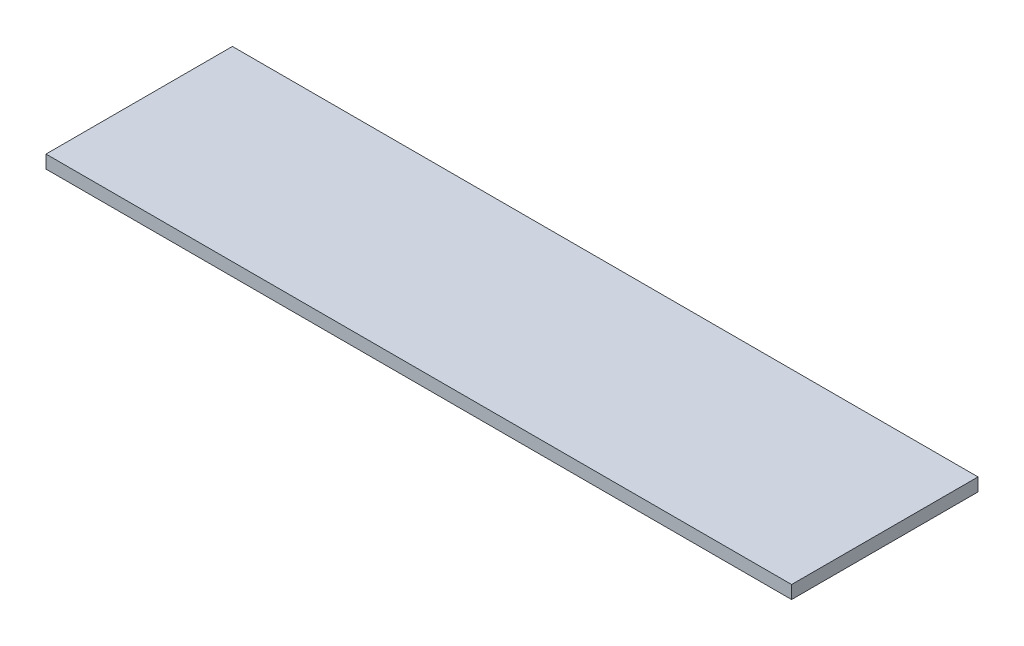
ISO-10303-21;
HEADER;
FILE_DESCRIPTION(('STEP AP214'),'2;1');
FILE_NAME('part.step','',(''),(''),'','','');
FILE_SCHEMA(('AUTOMOTIVE_DESIGN { 1 0 10303 214 1 1 1 1 }'));
ENDSEC;
DATA;
#1=APPLICATION_CONTEXT('core data for automotive mechanical design processes');
#2=APPLICATION_PROTOCOL_DEFINITION('international standard','automotive_design',2000,#1);
#3=PRODUCT_CONTEXT('',#1,'mechanical');
#4=PRODUCT('Part','Part','',(#3));
#5=PRODUCT_RELATED_PRODUCT_CATEGORY('part','',(#4));
#6=PRODUCT_DEFINITION_FORMATION('','',#4);
#7=PRODUCT_DEFINITION_CONTEXT('part definition',#1,'design');
#8=PRODUCT_DEFINITION('design','',#6,#7);
#9=PRODUCT_DEFINITION_SHAPE('','',#8);
#10=(LENGTH_UNIT() NAMED_UNIT(*) SI_UNIT(.MILLI.,.METRE.));
#11=(NAMED_UNIT(*) PLANE_ANGLE_UNIT() SI_UNIT($,.RADIAN.));
#12=(NAMED_UNIT(*) SI_UNIT($,.STERADIAN.) SOLID_ANGLE_UNIT());
#13=UNCERTAINTY_MEASURE_WITH_UNIT(LENGTH_MEASURE(1.E-05),#10,'distance_accuracy_value','');
#14=(GEOMETRIC_REPRESENTATION_CONTEXT(3) GLOBAL_UNCERTAINTY_ASSIGNED_CONTEXT((#13)) GLOBAL_UNIT_ASSIGNED_CONTEXT((#10,
#11,#12)) REPRESENTATION_CONTEXT('',''));
#15=CARTESIAN_POINT('',(0.,0.,0.));
#16=DIRECTION('',(0.,0.,1.));
#17=DIRECTION('',(1.,0.,0.));
#18=AXIS2_PLACEMENT_3D('',#15,#16,#17);
#19=CARTESIAN_POINT('',(20.,0.7,5.));
#20=DIRECTION('',(-1.,0.,0.));
#21=DIRECTION('',(0.,0.,1.));
#22=AXIS2_PLACEMENT_3D('',#19,#20,#21);
#23=PLANE('',#22);
#24=DIRECTION('',(0.,0.,-1.));
#25=VECTOR('',#24,1.);
#26=CARTESIAN_POINT('',(20.,0.,5.));
#27=LINE('',#26,#25);
#28=CARTESIAN_POINT('',(20.,0.,5.));
#29=VERTEX_POINT('',#28);
#30=CARTESIAN_POINT('',(20.,0.,-5.));
#31=VERTEX_POINT('',#30);
#32=EDGE_CURVE('E96',#29,#31,#27,.T.);
#33=ORIENTED_EDGE('',*,*,#32,.T.);
#34=DIRECTION('',(0.,-1.,0.));
#35=VECTOR('',#34,1.);
#36=CARTESIAN_POINT('',(20.,0.7,-5.));
#37=LINE('',#36,#35);
#38=CARTESIAN_POINT('',(20.,0.7,-5.));
#39=VERTEX_POINT('',#38);
#40=EDGE_CURVE('E11',#39,#31,#37,.T.);
#41=ORIENTED_EDGE('',*,*,#40,.F.);
#42=DIRECTION('',(0.,0.,-1.));
#43=VECTOR('',#42,1.);
#44=CARTESIAN_POINT('',(20.,0.7,5.));
#45=LINE('',#44,#43);
#46=CARTESIAN_POINT('',(20.,0.7,5.));
#47=VERTEX_POINT('',#46);
#48=EDGE_CURVE('E84',#47,#39,#45,.T.);
#49=ORIENTED_EDGE('',*,*,#48,.F.);
#50=DIRECTION('',(0.,-1.,0.));
#51=VECTOR('',#50,1.);
#52=CARTESIAN_POINT('',(20.,0.7,5.));
#53=LINE('',#52,#51);
#54=EDGE_CURVE('E92',#47,#29,#53,.T.);
#55=ORIENTED_EDGE('',*,*,#54,.T.);
#56=EDGE_LOOP('',(#33,#41,#49,#55));
#57=FACE_BOUND('',#56,.T.);
#58=ADVANCED_FACE('F33',(#57),#23,.F.);
#59=CARTESIAN_POINT('',(-20.,0.7,-5.));
#60=DIRECTION('',(0.,0.,1.));
#61=DIRECTION('',(1.,0.,0.));
#62=AXIS2_PLACEMENT_3D('',#59,#60,#61);
#63=PLANE('',#62);
#64=DIRECTION('',(-1.,0.,0.));
#65=VECTOR('',#64,1.);
#66=CARTESIAN_POINT('',(-20.,0.,-5.));
#67=LINE('',#66,#65);
#68=CARTESIAN_POINT('',(-20.,0.,-5.));
#69=VERTEX_POINT('',#68);
#70=EDGE_CURVE('E88',#31,#69,#67,.T.);
#71=ORIENTED_EDGE('',*,*,#70,.T.);
#72=DIRECTION('',(0.,-1.,0.));
#73=VECTOR('',#72,1.);
#74=CARTESIAN_POINT('',(-20.,0.7,-5.));
#75=LINE('',#74,#73);
#76=CARTESIAN_POINT('',(-20.,0.7,-5.));
#77=VERTEX_POINT('',#76);
#78=EDGE_CURVE('E41',#77,#69,#75,.T.);
#79=ORIENTED_EDGE('',*,*,#78,.F.);
#80=DIRECTION('',(-1.,0.,0.));
#81=VECTOR('',#80,1.);
#82=CARTESIAN_POINT('',(-20.,0.7,-5.));
#83=LINE('',#82,#81);
#84=EDGE_CURVE('E79',#39,#77,#83,.T.);
#85=ORIENTED_EDGE('',*,*,#84,.F.);
#86=ORIENTED_EDGE('',*,*,#40,.T.);
#87=EDGE_LOOP('',(#71,#79,#85,#86));
#88=FACE_BOUND('',#87,.T.);
#89=ADVANCED_FACE('F87',(#88),#63,.F.);
#90=CARTESIAN_POINT('',(-20.,0.7,5.));
#91=DIRECTION('',(1.,0.,0.));
#92=DIRECTION('',(0.,0.,-1.));
#93=AXIS2_PLACEMENT_3D('',#90,#91,#92);
#94=PLANE('',#93);
#95=DIRECTION('',(0.,0.,1.));
#96=VECTOR('',#95,1.);
#97=CARTESIAN_POINT('',(-20.,0.,5.));
#98=LINE('',#97,#96);
#99=CARTESIAN_POINT('',(-20.,0.,5.));
#100=VERTEX_POINT('',#99);
#101=EDGE_CURVE('E66',#69,#100,#98,.T.);
#102=ORIENTED_EDGE('',*,*,#101,.T.);
#103=DIRECTION('',(0.,-1.,0.));
#104=VECTOR('',#103,1.);
#105=CARTESIAN_POINT('',(-20.,0.7,5.));
#106=LINE('',#105,#104);
#107=CARTESIAN_POINT('',(-20.,0.7,5.));
#108=VERTEX_POINT('',#107);
#109=EDGE_CURVE('E89',#108,#100,#106,.T.);
#110=ORIENTED_EDGE('',*,*,#109,.F.);
#111=DIRECTION('',(0.,0.,1.));
#112=VECTOR('',#111,1.);
#113=CARTESIAN_POINT('',(-20.,0.7,5.));
#114=LINE('',#113,#112);
#115=EDGE_CURVE('E82',#77,#108,#114,.T.);
#116=ORIENTED_EDGE('',*,*,#115,.F.);
#117=ORIENTED_EDGE('',*,*,#78,.T.);
#118=EDGE_LOOP('',(#102,#110,#116,#117));
#119=FACE_BOUND('',#118,.T.);
#120=ADVANCED_FACE('F90',(#119),#94,.F.);
#121=CARTESIAN_POINT('',(-20.,0.7,5.));
#122=DIRECTION('',(0.,0.,-1.));
#123=DIRECTION('',(-1.,0.,0.));
#124=AXIS2_PLACEMENT_3D('',#121,#122,#123);
#125=PLANE('',#124);
#126=DIRECTION('',(1.,0.,0.));
#127=VECTOR('',#126,1.);
#128=CARTESIAN_POINT('',(-20.,0.,5.));
#129=LINE('',#128,#127);
#130=EDGE_CURVE('E72',#100,#29,#129,.T.);
#131=ORIENTED_EDGE('',*,*,#130,.T.);
#132=ORIENTED_EDGE('',*,*,#54,.F.);
#133=DIRECTION('',(1.,0.,0.));
#134=VECTOR('',#133,1.);
#135=CARTESIAN_POINT('',(-20.,0.7,5.));
#136=LINE('',#135,#134);
#137=EDGE_CURVE('E49',#108,#47,#136,.T.);
#138=ORIENTED_EDGE('',*,*,#137,.F.);
#139=ORIENTED_EDGE('',*,*,#109,.T.);
#140=EDGE_LOOP('',(#131,#132,#138,#139));
#141=FACE_BOUND('',#140,.T.);
#142=ADVANCED_FACE('F103',(#141),#125,.F.);
#143=CARTESIAN_POINT('',(0.,0.7,0.));
#144=DIRECTION('',(0.,-1.,0.));
#145=DIRECTION('',(0.,0.,-1.));
#146=AXIS2_PLACEMENT_3D('',#143,#144,#145);
#147=PLANE('',#146);
#148=ORIENTED_EDGE('',*,*,#48,.T.);
#149=ORIENTED_EDGE('',*,*,#84,.T.);
#150=ORIENTED_EDGE('',*,*,#115,.T.);
#151=ORIENTED_EDGE('',*,*,#137,.T.);
#152=EDGE_LOOP('',(#148,#149,#150,#151));
#153=FACE_BOUND('',#152,.T.);
#154=ADVANCED_FACE('F80',(#153),#147,.F.);
#155=CARTESIAN_POINT('',(0.,0.,0.));
#156=DIRECTION('',(0.,-1.,0.));
#157=DIRECTION('',(0.,0.,-1.));
#158=AXIS2_PLACEMENT_3D('',#155,#156,#157);
#159=PLANE('',#158);
#160=ORIENTED_EDGE('',*,*,#32,.F.);
#161=ORIENTED_EDGE('',*,*,#130,.F.);
#162=ORIENTED_EDGE('',*,*,#101,.F.);
#163=ORIENTED_EDGE('',*,*,#70,.F.);
#164=EDGE_LOOP('',(#160,#161,#162,#163));
#165=FACE_BOUND('',#164,.T.);
#166=ADVANCED_FACE('F106',(#165),#159,.T.);
#167=CLOSED_SHELL('',(#58,#89,#120,#142,#154,#166));
#168=MANIFOLD_SOLID_BREP('B2',#167);
#169=ADVANCED_BREP_SHAPE_REPRESENTATION('',(#18,#168),#14);
#170=SHAPE_DEFINITION_REPRESENTATION(#9,#169);
ENDSEC;
END-ISO-10303-21;
